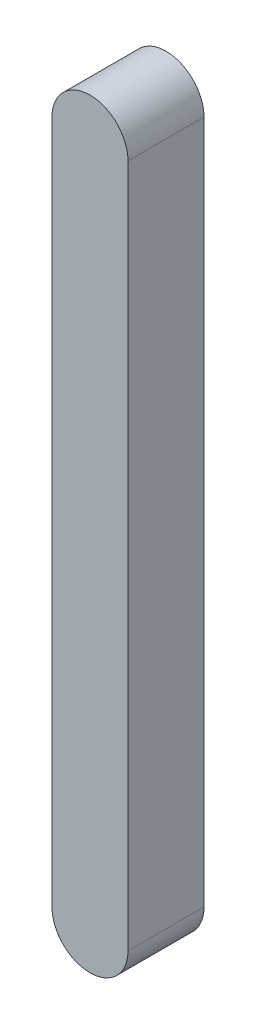
ISO-10303-21;
HEADER;
FILE_DESCRIPTION(('STEP AP214'),'2;1');
FILE_NAME('part.step','',(''),(''),'','','');
FILE_SCHEMA(('AUTOMOTIVE_DESIGN { 1 0 10303 214 1 1 1 1 }'));
ENDSEC;
DATA;
#1=APPLICATION_CONTEXT('core data for automotive mechanical design processes');
#2=APPLICATION_PROTOCOL_DEFINITION('international standard','automotive_design',2000,#1);
#3=PRODUCT_CONTEXT('',#1,'mechanical');
#4=PRODUCT('Part','Part','',(#3));
#5=PRODUCT_RELATED_PRODUCT_CATEGORY('part','',(#4));
#6=PRODUCT_DEFINITION_FORMATION('','',#4);
#7=PRODUCT_DEFINITION_CONTEXT('part definition',#1,'design');
#8=PRODUCT_DEFINITION('design','',#6,#7);
#9=PRODUCT_DEFINITION_SHAPE('','',#8);
#10=(LENGTH_UNIT() NAMED_UNIT(*) SI_UNIT(.MILLI.,.METRE.));
#11=(NAMED_UNIT(*) PLANE_ANGLE_UNIT() SI_UNIT($,.RADIAN.));
#12=(NAMED_UNIT(*) SI_UNIT($,.STERADIAN.) SOLID_ANGLE_UNIT());
#13=UNCERTAINTY_MEASURE_WITH_UNIT(LENGTH_MEASURE(1.E-05),#10,'distance_accuracy_value','');
#14=(GEOMETRIC_REPRESENTATION_CONTEXT(3) GLOBAL_UNCERTAINTY_ASSIGNED_CONTEXT((#13)) GLOBAL_UNIT_ASSIGNED_CONTEXT((#10,
#11,#12)) REPRESENTATION_CONTEXT('',''));
#15=CARTESIAN_POINT('',(0.,0.,0.));
#16=DIRECTION('',(0.,0.,1.));
#17=DIRECTION('',(1.,0.,0.));
#18=AXIS2_PLACEMENT_3D('',#15,#16,#17);
#19=CARTESIAN_POINT('',(-12.5,225.,-12.5));
#20=DIRECTION('',(1.,0.,0.));
#21=DIRECTION('',(0.,0.,-1.));
#22=AXIS2_PLACEMENT_3D('',#19,#20,#21);
#23=PLANE('',#22);
#24=DIRECTION('',(0.,0.,1.));
#25=VECTOR('',#24,1.);
#26=CARTESIAN_POINT('',(-12.5,0.,-12.5));
#27=LINE('',#26,#25);
#28=CARTESIAN_POINT('',(-12.5,0.,-12.5));
#29=VERTEX_POINT('',#28);
#30=CARTESIAN_POINT('',(-12.5,0.,12.5));
#31=VERTEX_POINT('',#30);
#32=EDGE_CURVE('E85',#29,#31,#27,.T.);
#33=ORIENTED_EDGE('',*,*,#32,.T.);
#34=DIRECTION('',(0.,-1.,0.));
#35=VECTOR('',#34,1.);
#36=CARTESIAN_POINT('',(-12.5,225.,12.5));
#37=LINE('',#36,#35);
#38=CARTESIAN_POINT('',(-12.5,225.,12.5));
#39=VERTEX_POINT('',#38);
#40=EDGE_CURVE('E11',#39,#31,#37,.T.);
#41=ORIENTED_EDGE('',*,*,#40,.F.);
#42=DIRECTION('',(0.,0.,1.));
#43=VECTOR('',#42,1.);
#44=CARTESIAN_POINT('',(-12.5,225.,-12.5));
#45=LINE('',#44,#43);
#46=CARTESIAN_POINT('',(-12.5,225.,-12.5));
#47=VERTEX_POINT('',#46);
#48=EDGE_CURVE('E84',#47,#39,#45,.T.);
#49=ORIENTED_EDGE('',*,*,#48,.F.);
#50=DIRECTION('',(0.,-1.,0.));
#51=VECTOR('',#50,1.);
#52=CARTESIAN_POINT('',(-12.5,225.,-12.5));
#53=LINE('',#52,#51);
#54=EDGE_CURVE('E99',#47,#29,#53,.T.);
#55=ORIENTED_EDGE('',*,*,#54,.T.);
#56=EDGE_LOOP('',(#33,#41,#49,#55));
#57=FACE_BOUND('',#56,.T.);
#58=ADVANCED_FACE('F39',(#57),#23,.F.);
#59=CARTESIAN_POINT('',(-12.5,225.,12.5));
#60=DIRECTION('',(0.,0.,-1.));
#61=DIRECTION('',(-1.,0.,0.));
#62=AXIS2_PLACEMENT_3D('',#59,#60,#61);
#63=PLANE('',#62);
#64=ORIENTED_EDGE('',*,*,#40,.T.);
#65=CARTESIAN_POINT('',(0.,0.,12.5));
#66=DIRECTION('',(0.,0.,1.));
#67=DIRECTION('',(1.,0.,0.));
#68=AXIS2_PLACEMENT_3D('',#65,#66,#67);
#69=CIRCLE('',#68,12.5);
#70=CARTESIAN_POINT('',(12.5,0.,12.5));
#71=VERTEX_POINT('',#70);
#72=EDGE_CURVE('E79',#31,#71,#69,.T.);
#73=ORIENTED_EDGE('',*,*,#72,.T.);
#74=DIRECTION('',(0.,-1.,0.));
#75=VECTOR('',#74,1.);
#76=CARTESIAN_POINT('',(12.5,225.,12.5));
#77=LINE('',#76,#75);
#78=CARTESIAN_POINT('',(12.5,225.,12.5));
#79=VERTEX_POINT('',#78);
#80=EDGE_CURVE('E48',#79,#71,#77,.T.);
#81=ORIENTED_EDGE('',*,*,#80,.F.);
#82=CARTESIAN_POINT('',(0.,225.,12.5));
#83=DIRECTION('',(0.,0.,1.));
#84=DIRECTION('',(1.,0.,0.));
#85=AXIS2_PLACEMENT_3D('',#82,#83,#84);
#86=CIRCLE('',#85,12.5);
#87=EDGE_CURVE('E113',#79,#39,#86,.T.);
#88=ORIENTED_EDGE('',*,*,#87,.T.);
#89=EDGE_LOOP('',(#64,#73,#81,#88));
#90=FACE_BOUND('',#89,.T.);
#91=ADVANCED_FACE('F88',(#90),#63,.F.);
#92=CARTESIAN_POINT('',(12.5,225.,-12.5));
#93=DIRECTION('',(-1.,0.,0.));
#94=DIRECTION('',(0.,0.,1.));
#95=AXIS2_PLACEMENT_3D('',#92,#93,#94);
#96=PLANE('',#95);
#97=DIRECTION('',(0.,0.,-1.));
#98=VECTOR('',#97,1.);
#99=CARTESIAN_POINT('',(12.5,0.,-12.5));
#100=LINE('',#99,#98);
#101=CARTESIAN_POINT('',(12.5,0.,-12.5));
#102=VERTEX_POINT('',#101);
#103=EDGE_CURVE('E75',#71,#102,#100,.T.);
#104=ORIENTED_EDGE('',*,*,#103,.T.);
#105=DIRECTION('',(0.,-1.,0.));
#106=VECTOR('',#105,1.);
#107=CARTESIAN_POINT('',(12.5,225.,-12.5));
#108=LINE('',#107,#106);
#109=CARTESIAN_POINT('',(12.5,225.,-12.5));
#110=VERTEX_POINT('',#109);
#111=EDGE_CURVE('E55',#110,#102,#108,.T.);
#112=ORIENTED_EDGE('',*,*,#111,.F.);
#113=DIRECTION('',(0.,0.,-1.));
#114=VECTOR('',#113,1.);
#115=CARTESIAN_POINT('',(12.5,225.,-12.5));
#116=LINE('',#115,#114);
#117=EDGE_CURVE('E95',#79,#110,#116,.T.);
#118=ORIENTED_EDGE('',*,*,#117,.F.);
#119=ORIENTED_EDGE('',*,*,#80,.T.);
#120=EDGE_LOOP('',(#104,#112,#118,#119));
#121=FACE_BOUND('',#120,.T.);
#122=ADVANCED_FACE('F93',(#121),#96,.F.);
#123=CARTESIAN_POINT('',(-12.5,225.,-12.5));
#124=DIRECTION('',(0.,0.,1.));
#125=DIRECTION('',(1.,0.,0.));
#126=AXIS2_PLACEMENT_3D('',#123,#124,#125);
#127=PLANE('',#126);
#128=ORIENTED_EDGE('',*,*,#111,.T.);
#129=CARTESIAN_POINT('',(0.,0.,-12.5));
#130=DIRECTION('',(0.,0.,1.));
#131=DIRECTION('',(1.,0.,0.));
#132=AXIS2_PLACEMENT_3D('',#129,#130,#131);
#133=CIRCLE('',#132,12.5);
#134=EDGE_CURVE('E81',#102,#29,#133,.F.);
#135=ORIENTED_EDGE('',*,*,#134,.T.);
#136=ORIENTED_EDGE('',*,*,#54,.F.);
#137=CARTESIAN_POINT('',(0.,225.,-12.5));
#138=DIRECTION('',(0.,0.,1.));
#139=DIRECTION('',(1.,0.,0.));
#140=AXIS2_PLACEMENT_3D('',#137,#138,#139);
#141=CIRCLE('',#140,12.5);
#142=EDGE_CURVE('E107',#47,#110,#141,.F.);
#143=ORIENTED_EDGE('',*,*,#142,.T.);
#144=EDGE_LOOP('',(#128,#135,#136,#143));
#145=FACE_BOUND('',#144,.T.);
#146=ADVANCED_FACE('F121',(#145),#127,.F.);
#147=CARTESIAN_POINT('',(0.,225.,-40.4508497187474));
#148=DIRECTION('',(0.,0.,1.));
#149=DIRECTION('',(1.,0.,0.));
#150=AXIS2_PLACEMENT_3D('',#147,#148,#149);
#151=CYLINDRICAL_SURFACE('',#150,12.5);
#152=ORIENTED_EDGE('',*,*,#142,.F.);
#153=ORIENTED_EDGE('',*,*,#48,.T.);
#154=ORIENTED_EDGE('',*,*,#87,.F.);
#155=ORIENTED_EDGE('',*,*,#117,.T.);
#156=EDGE_LOOP('',(#152,#153,#154,#155));
#157=FACE_BOUND('',#156,.T.);
#158=ADVANCED_FACE('F125',(#157),#151,.T.);
#159=CARTESIAN_POINT('',(0.,0.,-40.4508497187474));
#160=DIRECTION('',(0.,0.,1.));
#161=DIRECTION('',(1.,0.,0.));
#162=AXIS2_PLACEMENT_3D('',#159,#160,#161);
#163=CYLINDRICAL_SURFACE('',#162,12.5);
#164=ORIENTED_EDGE('',*,*,#134,.F.);
#165=ORIENTED_EDGE('',*,*,#103,.F.);
#166=ORIENTED_EDGE('',*,*,#72,.F.);
#167=ORIENTED_EDGE('',*,*,#32,.F.);
#168=EDGE_LOOP('',(#164,#165,#166,#167));
#169=FACE_BOUND('',#168,.T.);
#170=ADVANCED_FACE('F77',(#169),#163,.T.);
#171=CLOSED_SHELL('',(#58,#91,#122,#146,#158,#170));
#172=MANIFOLD_SOLID_BREP('B2',#171);
#173=ADVANCED_BREP_SHAPE_REPRESENTATION('',(#18,#172),#14);
#174=SHAPE_DEFINITION_REPRESENTATION(#9,#173);
ENDSEC;
END-ISO-10303-21;
